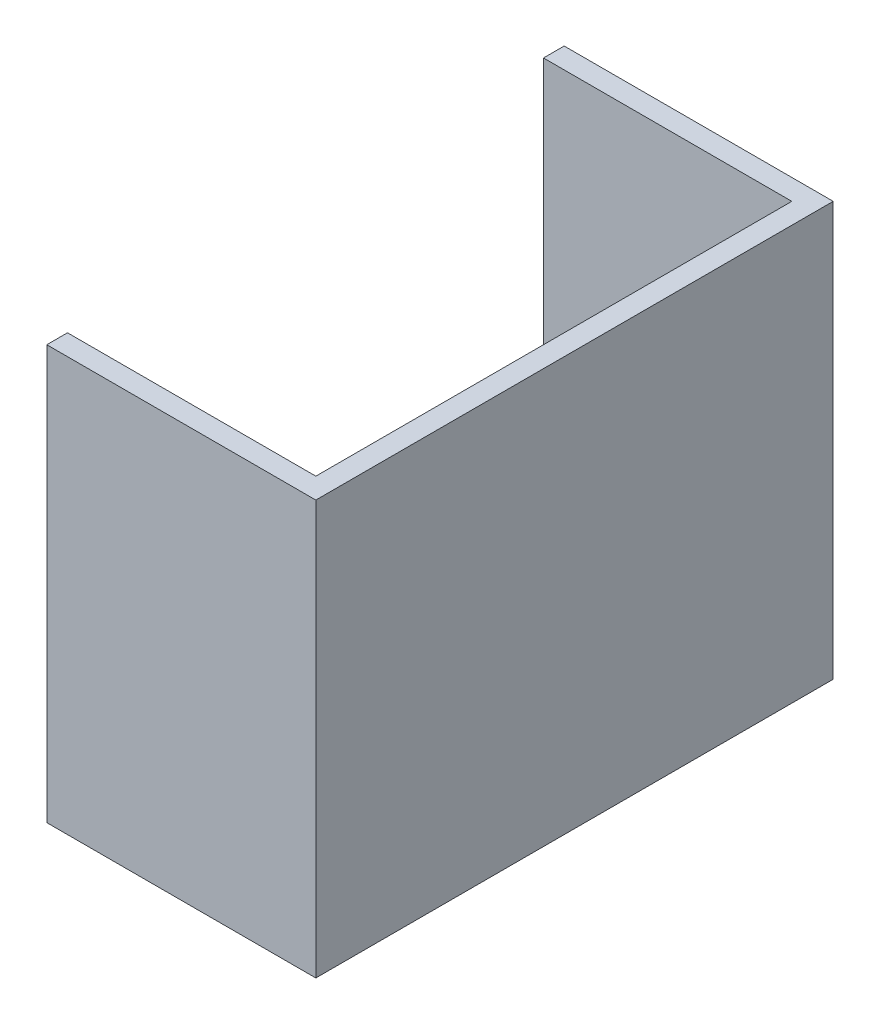
ISO-10303-21;
HEADER;
FILE_DESCRIPTION(('STEP AP214'),'2;1');
FILE_NAME('part.step','',(''),(''),'','','');
FILE_SCHEMA(('AUTOMOTIVE_DESIGN { 1 0 10303 214 1 1 1 1 }'));
ENDSEC;
DATA;
#1=APPLICATION_CONTEXT('core data for automotive mechanical design processes');
#2=APPLICATION_PROTOCOL_DEFINITION('international standard','automotive_design',2000,#1);
#3=PRODUCT_CONTEXT('',#1,'mechanical');
#4=PRODUCT('Part','Part','',(#3));
#5=PRODUCT_RELATED_PRODUCT_CATEGORY('part','',(#4));
#6=PRODUCT_DEFINITION_FORMATION('','',#4);
#7=PRODUCT_DEFINITION_CONTEXT('part definition',#1,'design');
#8=PRODUCT_DEFINITION('design','',#6,#7);
#9=PRODUCT_DEFINITION_SHAPE('','',#8);
#10=(LENGTH_UNIT() NAMED_UNIT(*) SI_UNIT(.MILLI.,.METRE.));
#11=(NAMED_UNIT(*) PLANE_ANGLE_UNIT() SI_UNIT($,.RADIAN.));
#12=(NAMED_UNIT(*) SI_UNIT($,.STERADIAN.) SOLID_ANGLE_UNIT());
#13=UNCERTAINTY_MEASURE_WITH_UNIT(LENGTH_MEASURE(1.E-05),#10,'distance_accuracy_value','');
#14=(GEOMETRIC_REPRESENTATION_CONTEXT(3) GLOBAL_UNCERTAINTY_ASSIGNED_CONTEXT((#13)) GLOBAL_UNIT_ASSIGNED_CONTEXT((#10,
#11,#12)) REPRESENTATION_CONTEXT('',''));
#15=CARTESIAN_POINT('',(0.,0.,0.));
#16=DIRECTION('',(0.,0.,1.));
#17=DIRECTION('',(1.,0.,0.));
#18=AXIS2_PLACEMENT_3D('',#15,#16,#17);
#19=CARTESIAN_POINT('',(-6.,20.,12.5));
#20=DIRECTION('',(1.,0.,0.));
#21=DIRECTION('',(0.,0.,-1.));
#22=AXIS2_PLACEMENT_3D('',#19,#20,#21);
#23=PLANE('',#22);
#24=DIRECTION('',(0.,-1.,0.));
#25=VECTOR('',#24,1.);
#26=CARTESIAN_POINT('',(-6.,20.,5.50000000000001));
#27=LINE('',#26,#25);
#28=CARTESIAN_POINT('',(-6.,1.,5.50000000000001));
#29=VERTEX_POINT('',#28);
#30=CARTESIAN_POINT('',(-6.,0.,5.50000000000001));
#31=VERTEX_POINT('',#30);
#32=EDGE_CURVE('E131',#29,#31,#27,.T.);
#33=ORIENTED_EDGE('',*,*,#32,.T.);
#34=DIRECTION('',(0.,0.,1.));
#35=VECTOR('',#34,1.);
#36=CARTESIAN_POINT('',(-6.,0.,12.5));
#37=LINE('',#36,#35);
#38=CARTESIAN_POINT('',(-6.,0.,12.5));
#39=VERTEX_POINT('',#38);
#40=EDGE_CURVE('E143',#31,#39,#37,.T.);
#41=ORIENTED_EDGE('',*,*,#40,.T.);
#42=DIRECTION('',(0.,-1.,0.));
#43=VECTOR('',#42,1.);
#44=CARTESIAN_POINT('',(-6.,20.,12.5));
#45=LINE('',#44,#43);
#46=CARTESIAN_POINT('',(-6.,20.,12.5));
#47=VERTEX_POINT('',#46);
#48=EDGE_CURVE('E165',#47,#39,#45,.T.);
#49=ORIENTED_EDGE('',*,*,#48,.F.);
#50=DIRECTION('',(0.,0.,1.));
#51=VECTOR('',#50,1.);
#52=CARTESIAN_POINT('',(-6.,20.,12.5));
#53=LINE('',#52,#51);
#54=CARTESIAN_POINT('',(-5.99999999999999,20.,11.5));
#55=VERTEX_POINT('',#54);
#56=EDGE_CURVE('E217',#55,#47,#53,.T.);
#57=ORIENTED_EDGE('',*,*,#56,.F.);
#58=DIRECTION('',(0.,-1.,0.));
#59=VECTOR('',#58,1.);
#60=CARTESIAN_POINT('',(-5.99999999999999,20.,11.5));
#61=LINE('',#60,#59);
#62=CARTESIAN_POINT('',(-5.99999999999999,1.,11.5));
#63=VERTEX_POINT('',#62);
#64=EDGE_CURVE('E211',#55,#63,#61,.T.);
#65=ORIENTED_EDGE('',*,*,#64,.T.);
#66=DIRECTION('',(0.,0.,1.));
#67=VECTOR('',#66,1.);
#68=CARTESIAN_POINT('',(-6.,1.,-11.5));
#69=LINE('',#68,#67);
#70=EDGE_CURVE('E146',#29,#63,#69,.T.);
#71=ORIENTED_EDGE('',*,*,#70,.F.);
#72=EDGE_LOOP('',(#33,#41,#49,#57,#65,#71));
#73=FACE_BOUND('',#72,.T.);
#74=ADVANCED_FACE('F35',(#73),#23,.F.);
#75=DIRECTION('',(0.,-1.,0.));
#76=VECTOR('',#75,1.);
#77=CARTESIAN_POINT('',(-6.,20.,-3.49999999999999));
#78=LINE('',#77,#76);
#79=CARTESIAN_POINT('',(-6.,1.,-3.49999999999999));
#80=VERTEX_POINT('',#79);
#81=CARTESIAN_POINT('',(-6.,0.,-3.49999999999999));
#82=VERTEX_POINT('',#81);
#83=EDGE_CURVE('E251',#80,#82,#78,.T.);
#84=ORIENTED_EDGE('',*,*,#83,.F.);
#85=CARTESIAN_POINT('',(-6.,1.,-11.5));
#86=VERTEX_POINT('',#85);
#87=EDGE_CURVE('E192',#86,#80,#69,.T.);
#88=ORIENTED_EDGE('',*,*,#87,.F.);
#89=DIRECTION('',(0.,-1.,0.));
#90=VECTOR('',#89,1.);
#91=CARTESIAN_POINT('',(-6.,20.,-11.5));
#92=LINE('',#91,#90);
#93=CARTESIAN_POINT('',(-6.,20.,-11.5));
#94=VERTEX_POINT('',#93);
#95=EDGE_CURVE('E204',#94,#86,#92,.T.);
#96=ORIENTED_EDGE('',*,*,#95,.F.);
#97=CARTESIAN_POINT('',(-6.,20.,-12.5));
#98=VERTEX_POINT('',#97);
#99=EDGE_CURVE('E218',#98,#94,#53,.T.);
#100=ORIENTED_EDGE('',*,*,#99,.F.);
#101=DIRECTION('',(0.,-1.,0.));
#102=VECTOR('',#101,1.);
#103=CARTESIAN_POINT('',(-6.,20.,-12.5));
#104=LINE('',#103,#102);
#105=CARTESIAN_POINT('',(-6.,0.,-12.5));
#106=VERTEX_POINT('',#105);
#107=EDGE_CURVE('E168',#98,#106,#104,.T.);
#108=ORIENTED_EDGE('',*,*,#107,.T.);
#109=EDGE_CURVE('E152',#106,#82,#37,.T.);
#110=ORIENTED_EDGE('',*,*,#109,.T.);
#111=EDGE_LOOP('',(#84,#88,#96,#100,#108,#110));
#112=FACE_BOUND('',#111,.T.);
#113=ADVANCED_FACE('F250',(#112),#23,.F.);
#114=CARTESIAN_POINT('',(0.,0.,0.));
#115=DIRECTION('',(0.,-1.,0.));
#116=DIRECTION('',(0.,0.,-1.));
#117=AXIS2_PLACEMENT_3D('',#114,#115,#116);
#118=PLANE('',#117);
#119=ORIENTED_EDGE('',*,*,#40,.F.);
#120=CARTESIAN_POINT('',(0.,0.,5.50000000000001));
#121=DIRECTION('',(0.,1.,0.));
#122=DIRECTION('',(0.,0.,1.));
#123=AXIS2_PLACEMENT_3D('',#120,#121,#122);
#124=CIRCLE('',#123,6.);
#125=CARTESIAN_POINT('',(6.,0.,5.50000000000001));
#126=VERTEX_POINT('',#125);
#127=EDGE_CURVE('E128',#31,#126,#124,.T.);
#128=ORIENTED_EDGE('',*,*,#127,.T.);
#129=DIRECTION('',(0.,0.,-1.));
#130=VECTOR('',#129,1.);
#131=CARTESIAN_POINT('',(6.,0.,-3.49999999999999));
#132=LINE('',#131,#130);
#133=CARTESIAN_POINT('',(6.,0.,-3.49999999999999));
#134=VERTEX_POINT('',#133);
#135=EDGE_CURVE('E138',#126,#134,#132,.T.);
#136=ORIENTED_EDGE('',*,*,#135,.T.);
#137=DIRECTION('',(-1.,0.,0.));
#138=VECTOR('',#137,1.);
#139=CARTESIAN_POINT('',(-6.,0.,-3.49999999999999));
#140=LINE('',#139,#138);
#141=EDGE_CURVE('E296',#134,#82,#140,.T.);
#142=ORIENTED_EDGE('',*,*,#141,.T.);
#143=ORIENTED_EDGE('',*,*,#109,.F.);
#144=DIRECTION('',(-1.,0.,0.));
#145=VECTOR('',#144,1.);
#146=CARTESIAN_POINT('',(-6.,0.,-12.5));
#147=LINE('',#146,#145);
#148=CARTESIAN_POINT('',(7.,0.,-12.5));
#149=VERTEX_POINT('',#148);
#150=EDGE_CURVE('E153',#149,#106,#147,.T.);
#151=ORIENTED_EDGE('',*,*,#150,.F.);
#152=DIRECTION('',(0.,0.,-1.));
#153=VECTOR('',#152,1.);
#154=CARTESIAN_POINT('',(7.,0.,12.5));
#155=LINE('',#154,#153);
#156=CARTESIAN_POINT('',(7.,0.,12.5));
#157=VERTEX_POINT('',#156);
#158=EDGE_CURVE('E156',#157,#149,#155,.T.);
#159=ORIENTED_EDGE('',*,*,#158,.F.);
#160=DIRECTION('',(1.,0.,0.));
#161=VECTOR('',#160,1.);
#162=CARTESIAN_POINT('',(-6.,0.,12.5));
#163=LINE('',#162,#161);
#164=EDGE_CURVE('E151',#39,#157,#163,.T.);
#165=ORIENTED_EDGE('',*,*,#164,.F.);
#166=EDGE_LOOP('',(#119,#128,#136,#142,#143,#151,#159,#165));
#167=FACE_BOUND('',#166,.T.);
#168=ADVANCED_FACE('F149',(#167),#118,.T.);
#169=CARTESIAN_POINT('',(0.,1.,0.));
#170=DIRECTION('',(0.,1.,0.));
#171=DIRECTION('',(0.,0.,1.));
#172=AXIS2_PLACEMENT_3D('',#169,#170,#171);
#173=PLANE('',#172);
#174=DIRECTION('',(1.,0.,0.));
#175=VECTOR('',#174,1.);
#176=CARTESIAN_POINT('',(-5.99999999999999,1.,11.5));
#177=LINE('',#176,#175);
#178=CARTESIAN_POINT('',(0.,1.,11.5));
#179=VERTEX_POINT('',#178);
#180=EDGE_CURVE('E190',#63,#179,#177,.T.);
#181=ORIENTED_EDGE('',*,*,#180,.T.);
#182=CARTESIAN_POINT('',(0.,1.,5.50000000000001));
#183=DIRECTION('',(0.,1.,0.));
#184=DIRECTION('',(0.,0.,1.));
#185=AXIS2_PLACEMENT_3D('',#182,#183,#184);
#186=CIRCLE('',#185,6.);
#187=EDGE_CURVE('E11',#179,#29,#186,.F.);
#188=ORIENTED_EDGE('',*,*,#187,.T.);
#189=ORIENTED_EDGE('',*,*,#70,.T.);
#190=EDGE_LOOP('',(#181,#188,#189));
#191=FACE_BOUND('',#190,.T.);
#192=ADVANCED_FACE('F195',(#191),#173,.T.);
#193=DIRECTION('',(0.,0.,-1.));
#194=VECTOR('',#193,1.);
#195=CARTESIAN_POINT('',(6.,1.,-11.5));
#196=LINE('',#195,#194);
#197=CARTESIAN_POINT('',(6.00000000000001,1.,11.5));
#198=VERTEX_POINT('',#197);
#199=CARTESIAN_POINT('',(6.,1.,5.50000000000001));
#200=VERTEX_POINT('',#199);
#201=EDGE_CURVE('E185',#198,#200,#196,.T.);
#202=ORIENTED_EDGE('',*,*,#201,.T.);
#203=EDGE_CURVE('E39',#200,#179,#186,.F.);
#204=ORIENTED_EDGE('',*,*,#203,.T.);
#205=EDGE_CURVE('E182',#179,#198,#177,.T.);
#206=ORIENTED_EDGE('',*,*,#205,.T.);
#207=EDGE_LOOP('',(#202,#204,#206));
#208=FACE_BOUND('',#207,.T.);
#209=ADVANCED_FACE('F181',(#208),#173,.T.);
#210=ORIENTED_EDGE('',*,*,#87,.T.);
#211=DIRECTION('',(1.,0.,0.));
#212=VECTOR('',#211,1.);
#213=CARTESIAN_POINT('',(0.,1.,-3.49999999999999));
#214=LINE('',#213,#212);
#215=CARTESIAN_POINT('',(6.,1.,-3.49999999999999));
#216=VERTEX_POINT('',#215);
#217=EDGE_CURVE('E173',#80,#216,#214,.T.);
#218=ORIENTED_EDGE('',*,*,#217,.T.);
#219=CARTESIAN_POINT('',(6.,1.,-11.5));
#220=VERTEX_POINT('',#219);
#221=EDGE_CURVE('E196',#216,#220,#196,.T.);
#222=ORIENTED_EDGE('',*,*,#221,.T.);
#223=DIRECTION('',(-1.,0.,0.));
#224=VECTOR('',#223,1.);
#225=CARTESIAN_POINT('',(-6.,1.,-11.5));
#226=LINE('',#225,#224);
#227=EDGE_CURVE('E201',#220,#86,#226,.T.);
#228=ORIENTED_EDGE('',*,*,#227,.T.);
#229=EDGE_LOOP('',(#210,#218,#222,#228));
#230=FACE_BOUND('',#229,.T.);
#231=ADVANCED_FACE('F252',(#230),#173,.T.);
#232=CARTESIAN_POINT('',(0.,20.,0.));
#233=DIRECTION('',(0.,-1.,0.));
#234=DIRECTION('',(0.,0.,-1.));
#235=AXIS2_PLACEMENT_3D('',#232,#233,#234);
#236=PLANE('',#235);
#237=DIRECTION('',(1.,0.,0.));
#238=VECTOR('',#237,1.);
#239=CARTESIAN_POINT('',(-5.99999999999999,20.,11.5));
#240=LINE('',#239,#238);
#241=CARTESIAN_POINT('',(6.00000000000001,20.,11.5));
#242=VERTEX_POINT('',#241);
#243=EDGE_CURVE('E203',#55,#242,#240,.T.);
#244=ORIENTED_EDGE('',*,*,#243,.F.);
#245=ORIENTED_EDGE('',*,*,#56,.T.);
#246=DIRECTION('',(1.,0.,0.));
#247=VECTOR('',#246,1.);
#248=CARTESIAN_POINT('',(-6.,20.,12.5));
#249=LINE('',#248,#247);
#250=CARTESIAN_POINT('',(7.,20.,12.5));
#251=VERTEX_POINT('',#250);
#252=EDGE_CURVE('E166',#47,#251,#249,.T.);
#253=ORIENTED_EDGE('',*,*,#252,.T.);
#254=DIRECTION('',(0.,0.,-1.));
#255=VECTOR('',#254,1.);
#256=CARTESIAN_POINT('',(7.,20.,12.5));
#257=LINE('',#256,#255);
#258=CARTESIAN_POINT('',(7.,20.,-12.5));
#259=VERTEX_POINT('',#258);
#260=EDGE_CURVE('E161',#251,#259,#257,.T.);
#261=ORIENTED_EDGE('',*,*,#260,.T.);
#262=DIRECTION('',(-1.,0.,0.));
#263=VECTOR('',#262,1.);
#264=CARTESIAN_POINT('',(-6.,20.,-12.5));
#265=LINE('',#264,#263);
#266=EDGE_CURVE('E215',#259,#98,#265,.T.);
#267=ORIENTED_EDGE('',*,*,#266,.T.);
#268=ORIENTED_EDGE('',*,*,#99,.T.);
#269=DIRECTION('',(-1.,0.,0.));
#270=VECTOR('',#269,1.);
#271=CARTESIAN_POINT('',(-6.,20.,-11.5));
#272=LINE('',#271,#270);
#273=CARTESIAN_POINT('',(6.,20.,-11.5));
#274=VERTEX_POINT('',#273);
#275=EDGE_CURVE('E208',#274,#94,#272,.T.);
#276=ORIENTED_EDGE('',*,*,#275,.F.);
#277=DIRECTION('',(0.,0.,-1.));
#278=VECTOR('',#277,1.);
#279=CARTESIAN_POINT('',(6.,20.,-11.5));
#280=LINE('',#279,#278);
#281=EDGE_CURVE('E58',#242,#274,#280,.T.);
#282=ORIENTED_EDGE('',*,*,#281,.F.);
#283=EDGE_LOOP('',(#244,#245,#253,#261,#267,#268,#276,#282));
#284=FACE_BOUND('',#283,.T.);
#285=ADVANCED_FACE('F234',(#284),#236,.F.);
#286=CARTESIAN_POINT('',(7.,20.,12.5));
#287=DIRECTION('',(-1.,0.,0.));
#288=DIRECTION('',(0.,0.,1.));
#289=AXIS2_PLACEMENT_3D('',#286,#287,#288);
#290=PLANE('',#289);
#291=ORIENTED_EDGE('',*,*,#158,.T.);
#292=DIRECTION('',(0.,-1.,0.));
#293=VECTOR('',#292,1.);
#294=CARTESIAN_POINT('',(7.,20.,-12.5));
#295=LINE('',#294,#293);
#296=EDGE_CURVE('E171',#259,#149,#295,.T.);
#297=ORIENTED_EDGE('',*,*,#296,.F.);
#298=ORIENTED_EDGE('',*,*,#260,.F.);
#299=DIRECTION('',(0.,-1.,0.));
#300=VECTOR('',#299,1.);
#301=CARTESIAN_POINT('',(7.,20.,12.5));
#302=LINE('',#301,#300);
#303=EDGE_CURVE('E162',#251,#157,#302,.T.);
#304=ORIENTED_EDGE('',*,*,#303,.T.);
#305=EDGE_LOOP('',(#291,#297,#298,#304));
#306=FACE_BOUND('',#305,.T.);
#307=ADVANCED_FACE('F37',(#306),#290,.F.);
#308=CARTESIAN_POINT('',(-6.,20.,-12.5));
#309=DIRECTION('',(0.,0.,1.));
#310=DIRECTION('',(1.,0.,0.));
#311=AXIS2_PLACEMENT_3D('',#308,#309,#310);
#312=PLANE('',#311);
#313=ORIENTED_EDGE('',*,*,#150,.T.);
#314=ORIENTED_EDGE('',*,*,#107,.F.);
#315=ORIENTED_EDGE('',*,*,#266,.F.);
#316=ORIENTED_EDGE('',*,*,#296,.T.);
#317=EDGE_LOOP('',(#313,#314,#315,#316));
#318=FACE_BOUND('',#317,.T.);
#319=ADVANCED_FACE('F230',(#318),#312,.F.);
#320=CARTESIAN_POINT('',(-6.,20.,12.5));
#321=DIRECTION('',(0.,0.,-1.));
#322=DIRECTION('',(-1.,0.,0.));
#323=AXIS2_PLACEMENT_3D('',#320,#321,#322);
#324=PLANE('',#323);
#325=ORIENTED_EDGE('',*,*,#164,.T.);
#326=ORIENTED_EDGE('',*,*,#303,.F.);
#327=ORIENTED_EDGE('',*,*,#252,.F.);
#328=ORIENTED_EDGE('',*,*,#48,.T.);
#329=EDGE_LOOP('',(#325,#326,#327,#328));
#330=FACE_BOUND('',#329,.T.);
#331=ADVANCED_FACE('F238',(#330),#324,.F.);
#332=CARTESIAN_POINT('',(-5.99999999999999,20.,11.5));
#333=DIRECTION('',(0.,0.,-1.));
#334=DIRECTION('',(-1.,0.,0.));
#335=AXIS2_PLACEMENT_3D('',#332,#333,#334);
#336=PLANE('',#335);
#337=ORIENTED_EDGE('',*,*,#243,.T.);
#338=DIRECTION('',(0.,-1.,0.));
#339=VECTOR('',#338,1.);
#340=CARTESIAN_POINT('',(6.00000000000001,20.,11.5));
#341=LINE('',#340,#339);
#342=EDGE_CURVE('E191',#242,#198,#341,.T.);
#343=ORIENTED_EDGE('',*,*,#342,.T.);
#344=ORIENTED_EDGE('',*,*,#205,.F.);
#345=ORIENTED_EDGE('',*,*,#180,.F.);
#346=ORIENTED_EDGE('',*,*,#64,.F.);
#347=EDGE_LOOP('',(#337,#343,#344,#345,#346));
#348=FACE_BOUND('',#347,.T.);
#349=ADVANCED_FACE('F189',(#348),#336,.T.);
#350=CARTESIAN_POINT('',(6.,20.,-11.5));
#351=DIRECTION('',(-1.,0.,0.));
#352=DIRECTION('',(0.,0.,1.));
#353=AXIS2_PLACEMENT_3D('',#350,#351,#352);
#354=PLANE('',#353);
#355=ORIENTED_EDGE('',*,*,#281,.T.);
#356=DIRECTION('',(0.,-1.,0.));
#357=VECTOR('',#356,1.);
#358=CARTESIAN_POINT('',(6.,20.,-11.5));
#359=LINE('',#358,#357);
#360=EDGE_CURVE('E207',#274,#220,#359,.T.);
#361=ORIENTED_EDGE('',*,*,#360,.T.);
#362=ORIENTED_EDGE('',*,*,#221,.F.);
#363=DIRECTION('',(0.,-1.,0.));
#364=VECTOR('',#363,1.);
#365=CARTESIAN_POINT('',(6.,20.,-3.49999999999999));
#366=LINE('',#365,#364);
#367=EDGE_CURVE('E50',#216,#134,#366,.T.);
#368=ORIENTED_EDGE('',*,*,#367,.T.);
#369=ORIENTED_EDGE('',*,*,#135,.F.);
#370=DIRECTION('',(0.,-1.,0.));
#371=VECTOR('',#370,1.);
#372=CARTESIAN_POINT('',(6.,20.,5.50000000000001));
#373=LINE('',#372,#371);
#374=EDGE_CURVE('E133',#200,#126,#373,.T.);
#375=ORIENTED_EDGE('',*,*,#374,.F.);
#376=ORIENTED_EDGE('',*,*,#201,.F.);
#377=ORIENTED_EDGE('',*,*,#342,.F.);
#378=EDGE_LOOP('',(#355,#361,#362,#368,#369,#375,#376,#377));
#379=FACE_BOUND('',#378,.T.);
#380=ADVANCED_FACE('F253',(#379),#354,.T.);
#381=CARTESIAN_POINT('',(-6.,20.,-11.5));
#382=DIRECTION('',(0.,0.,1.));
#383=DIRECTION('',(1.,0.,0.));
#384=AXIS2_PLACEMENT_3D('',#381,#382,#383);
#385=PLANE('',#384);
#386=ORIENTED_EDGE('',*,*,#227,.F.);
#387=ORIENTED_EDGE('',*,*,#360,.F.);
#388=ORIENTED_EDGE('',*,*,#275,.T.);
#389=ORIENTED_EDGE('',*,*,#95,.T.);
#390=EDGE_LOOP('',(#386,#387,#388,#389));
#391=FACE_BOUND('',#390,.T.);
#392=ADVANCED_FACE('F246',(#391),#385,.T.);
#393=CARTESIAN_POINT('',(0.,20.,5.50000000000001));
#394=DIRECTION('',(0.,-1.,0.));
#395=DIRECTION('',(0.,0.,-1.));
#396=AXIS2_PLACEMENT_3D('',#393,#394,#395);
#397=CYLINDRICAL_SURFACE('',#396,6.);
#398=ORIENTED_EDGE('',*,*,#203,.F.);
#399=ORIENTED_EDGE('',*,*,#374,.T.);
#400=ORIENTED_EDGE('',*,*,#127,.F.);
#401=ORIENTED_EDGE('',*,*,#32,.F.);
#402=ORIENTED_EDGE('',*,*,#187,.F.);
#403=EDGE_LOOP('',(#398,#399,#400,#401,#402));
#404=FACE_BOUND('',#403,.T.);
#405=ADVANCED_FACE('F130',(#404),#397,.F.);
#406=CARTESIAN_POINT('',(-6.,20.,-3.49999999999999));
#407=DIRECTION('',(0.,0.,1.));
#408=DIRECTION('',(1.,0.,0.));
#409=AXIS2_PLACEMENT_3D('',#406,#407,#408);
#410=PLANE('',#409);
#411=ORIENTED_EDGE('',*,*,#83,.T.);
#412=ORIENTED_EDGE('',*,*,#141,.F.);
#413=ORIENTED_EDGE('',*,*,#367,.F.);
#414=ORIENTED_EDGE('',*,*,#217,.F.);
#415=EDGE_LOOP('',(#411,#412,#413,#414));
#416=FACE_BOUND('',#415,.T.);
#417=ADVANCED_FACE('F292',(#416),#410,.T.);
#418=CLOSED_SHELL('',(#74,#113,#168,#192,#209,#231,#285,#307,#319,#331,#349,#380,#392,#405,#417));
#419=MANIFOLD_SOLID_BREP('B2',#418);
#420=ADVANCED_BREP_SHAPE_REPRESENTATION('',(#18,#419),#14);
#421=SHAPE_DEFINITION_REPRESENTATION(#9,#420);
ENDSEC;
END-ISO-10303-21;
